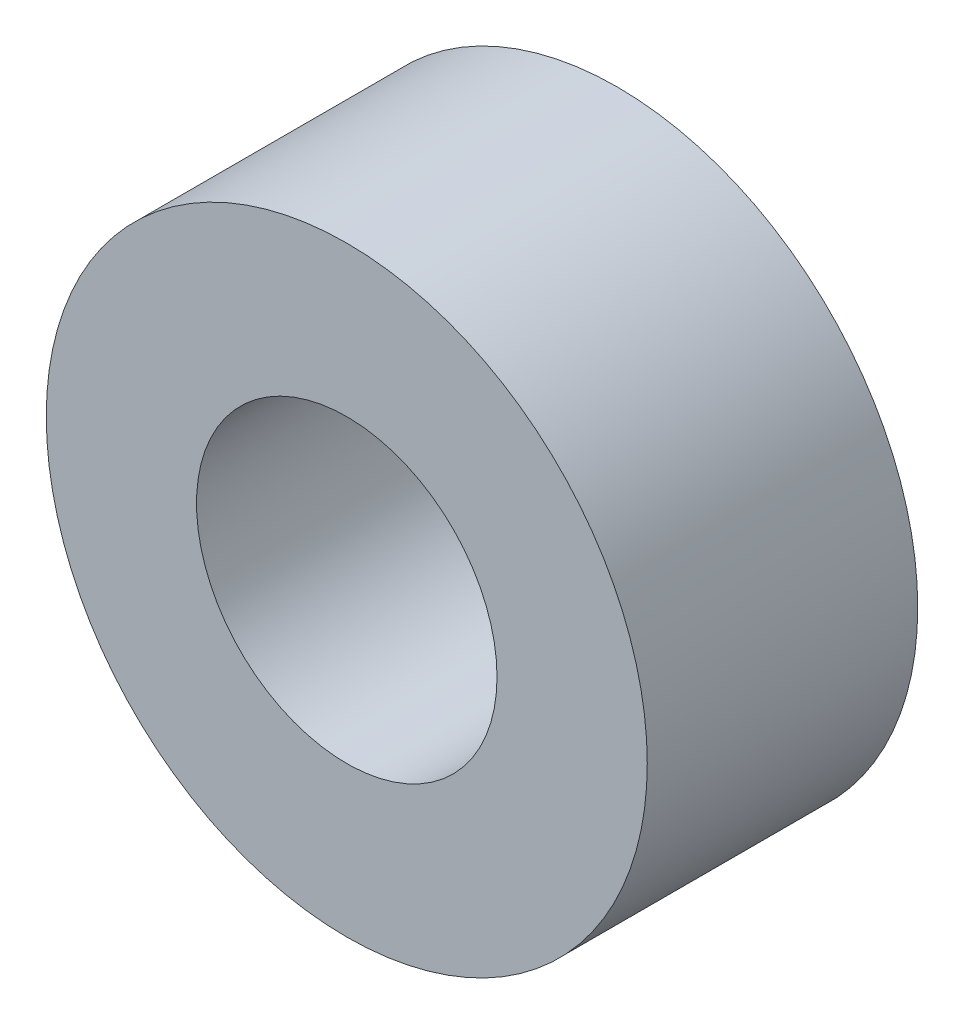
ISO-10303-21;
HEADER;
FILE_DESCRIPTION(('STEP AP214'),'2;1');
FILE_NAME('part.step','',(''),(''),'','','');
FILE_SCHEMA(('AUTOMOTIVE_DESIGN { 1 0 10303 214 1 1 1 1 }'));
ENDSEC;
DATA;
#1=APPLICATION_CONTEXT('core data for automotive mechanical design processes');
#2=APPLICATION_PROTOCOL_DEFINITION('international standard','automotive_design',2000,#1);
#3=PRODUCT_CONTEXT('',#1,'mechanical');
#4=PRODUCT('Part','Part','',(#3));
#5=PRODUCT_RELATED_PRODUCT_CATEGORY('part','',(#4));
#6=PRODUCT_DEFINITION_FORMATION('','',#4);
#7=PRODUCT_DEFINITION_CONTEXT('part definition',#1,'design');
#8=PRODUCT_DEFINITION('design','',#6,#7);
#9=PRODUCT_DEFINITION_SHAPE('','',#8);
#10=(LENGTH_UNIT() NAMED_UNIT(*) SI_UNIT(.MILLI.,.METRE.));
#11=(NAMED_UNIT(*) PLANE_ANGLE_UNIT() SI_UNIT($,.RADIAN.));
#12=(NAMED_UNIT(*) SI_UNIT($,.STERADIAN.) SOLID_ANGLE_UNIT());
#13=UNCERTAINTY_MEASURE_WITH_UNIT(LENGTH_MEASURE(1.E-05),#10,'distance_accuracy_value','');
#14=(GEOMETRIC_REPRESENTATION_CONTEXT(3) GLOBAL_UNCERTAINTY_ASSIGNED_CONTEXT((#13)) GLOBAL_UNIT_ASSIGNED_CONTEXT((#10,
#11,#12)) REPRESENTATION_CONTEXT('',''));
#15=CARTESIAN_POINT('',(0.,0.,0.));
#16=DIRECTION('',(0.,0.,1.));
#17=DIRECTION('',(1.,0.,0.));
#18=AXIS2_PLACEMENT_3D('',#15,#16,#17);
#19=CARTESIAN_POINT('',(0.,0.,11.43));
#20=DIRECTION('',(0.,0.,-1.));
#21=DIRECTION('',(-1.,0.,0.));
#22=AXIS2_PLACEMENT_3D('',#19,#20,#21);
#23=CYLINDRICAL_SURFACE('',#22,12.7);
#24=CARTESIAN_POINT('',(0.,0.,11.43));
#25=DIRECTION('',(0.,0.,1.));
#26=DIRECTION('',(1.,0.,0.));
#27=AXIS2_PLACEMENT_3D('',#24,#25,#26);
#28=CIRCLE('',#27,12.7);
#29=CARTESIAN_POINT('',(12.7,0.,11.43));
#30=VERTEX_POINT('',#29);
#31=EDGE_CURVE('E10',#30,#30,#28,.T.);
#32=ORIENTED_EDGE('',*,*,#31,.F.);
#33=EDGE_LOOP('',(#32));
#34=FACE_BOUND('',#33,.T.);
#35=CARTESIAN_POINT('',(0.,0.,0.));
#36=DIRECTION('',(0.,0.,1.));
#37=DIRECTION('',(1.,0.,0.));
#38=AXIS2_PLACEMENT_3D('',#35,#36,#37);
#39=CIRCLE('',#38,12.7);
#40=CARTESIAN_POINT('',(12.7,0.,0.));
#41=VERTEX_POINT('',#40);
#42=EDGE_CURVE('E34',#41,#41,#39,.T.);
#43=ORIENTED_EDGE('',*,*,#42,.T.);
#44=EDGE_LOOP('',(#43));
#45=FACE_BOUND('',#44,.T.);
#46=ADVANCED_FACE('F31',(#34,#45),#23,.T.);
#47=CARTESIAN_POINT('',(0.,0.,11.43));
#48=DIRECTION('',(0.,0.,1.));
#49=DIRECTION('',(1.,0.,0.));
#50=AXIS2_PLACEMENT_3D('',#47,#48,#49);
#51=PLANE('',#50);
#52=CARTESIAN_POINT('',(0.,0.,11.43));
#53=DIRECTION('',(0.,0.,1.));
#54=DIRECTION('',(1.,0.,0.));
#55=AXIS2_PLACEMENT_3D('',#52,#53,#54);
#56=CIRCLE('',#55,6.35);
#57=CARTESIAN_POINT('',(6.35,0.,11.43));
#58=VERTEX_POINT('',#57);
#59=EDGE_CURVE('E43',#58,#58,#56,.T.);
#60=ORIENTED_EDGE('',*,*,#59,.F.);
#61=EDGE_LOOP('',(#60));
#62=FACE_BOUND('',#61,.T.);
#63=ORIENTED_EDGE('',*,*,#31,.T.);
#64=EDGE_LOOP('',(#63));
#65=FACE_BOUND('',#64,.T.);
#66=ADVANCED_FACE('F58',(#62,#65),#51,.T.);
#67=CARTESIAN_POINT('',(0.,0.,0.));
#68=DIRECTION('',(0.,0.,1.));
#69=DIRECTION('',(1.,0.,0.));
#70=AXIS2_PLACEMENT_3D('',#67,#68,#69);
#71=PLANE('',#70);
#72=CARTESIAN_POINT('',(0.,0.,0.));
#73=DIRECTION('',(0.,0.,1.));
#74=DIRECTION('',(1.,0.,0.));
#75=AXIS2_PLACEMENT_3D('',#72,#73,#74);
#76=CIRCLE('',#75,6.35);
#77=CARTESIAN_POINT('',(6.35,0.,0.));
#78=VERTEX_POINT('',#77);
#79=EDGE_CURVE('E41',#78,#78,#76,.T.);
#80=ORIENTED_EDGE('',*,*,#79,.T.);
#81=EDGE_LOOP('',(#80));
#82=FACE_BOUND('',#81,.T.);
#83=ORIENTED_EDGE('',*,*,#42,.F.);
#84=EDGE_LOOP('',(#83));
#85=FACE_BOUND('',#84,.T.);
#86=ADVANCED_FACE('F49',(#82,#85),#71,.F.);
#87=CARTESIAN_POINT('',(0.,0.,0.));
#88=DIRECTION('',(0.,0.,1.));
#89=DIRECTION('',(1.,0.,0.));
#90=AXIS2_PLACEMENT_3D('',#87,#88,#89);
#91=CYLINDRICAL_SURFACE('',#90,6.35);
#92=ORIENTED_EDGE('',*,*,#79,.F.);
#93=EDGE_LOOP('',(#92));
#94=FACE_BOUND('',#93,.T.);
#95=ORIENTED_EDGE('',*,*,#59,.T.);
#96=EDGE_LOOP('',(#95));
#97=FACE_BOUND('',#96,.T.);
#98=ADVANCED_FACE('F52',(#94,#97),#91,.F.);
#99=CLOSED_SHELL('',(#46,#66,#86,#98));
#100=MANIFOLD_SOLID_BREP('B2',#99);
#101=ADVANCED_BREP_SHAPE_REPRESENTATION('',(#18,#100),#14);
#102=SHAPE_DEFINITION_REPRESENTATION(#9,#101);
ENDSEC;
END-ISO-10303-21;
